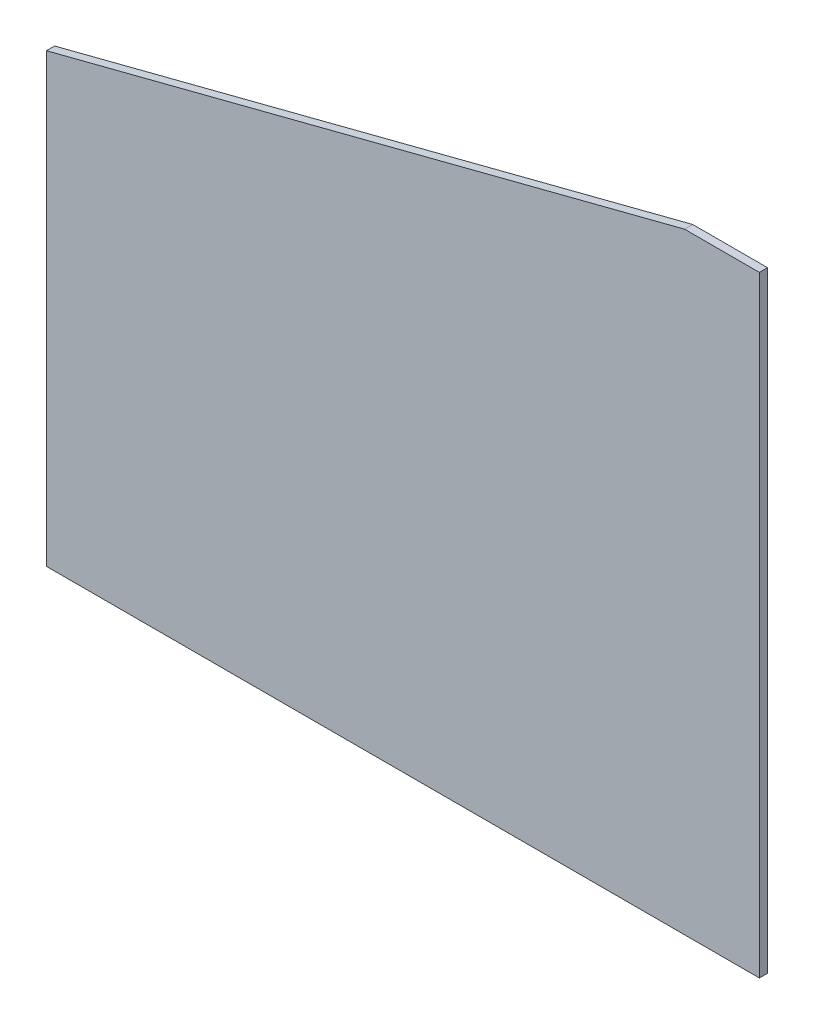
ISO-10303-21;
HEADER;
FILE_DESCRIPTION(('STEP AP214'),'2;1');
FILE_NAME('part.step','',(''),(''),'','','');
FILE_SCHEMA(('AUTOMOTIVE_DESIGN { 1 0 10303 214 1 1 1 1 }'));
ENDSEC;
DATA;
#1=APPLICATION_CONTEXT('core data for automotive mechanical design processes');
#2=APPLICATION_PROTOCOL_DEFINITION('international standard','automotive_design',2000,#1);
#3=PRODUCT_CONTEXT('',#1,'mechanical');
#4=PRODUCT('Part','Part','',(#3));
#5=PRODUCT_RELATED_PRODUCT_CATEGORY('part','',(#4));
#6=PRODUCT_DEFINITION_FORMATION('','',#4);
#7=PRODUCT_DEFINITION_CONTEXT('part definition',#1,'design');
#8=PRODUCT_DEFINITION('design','',#6,#7);
#9=PRODUCT_DEFINITION_SHAPE('','',#8);
#10=(LENGTH_UNIT() NAMED_UNIT(*) SI_UNIT(.MILLI.,.METRE.));
#11=(NAMED_UNIT(*) PLANE_ANGLE_UNIT() SI_UNIT($,.RADIAN.));
#12=(NAMED_UNIT(*) SI_UNIT($,.STERADIAN.) SOLID_ANGLE_UNIT());
#13=UNCERTAINTY_MEASURE_WITH_UNIT(LENGTH_MEASURE(1.E-05),#10,'distance_accuracy_value','');
#14=(GEOMETRIC_REPRESENTATION_CONTEXT(3) GLOBAL_UNCERTAINTY_ASSIGNED_CONTEXT((#13)) GLOBAL_UNIT_ASSIGNED_CONTEXT((#10,
#11,#12)) REPRESENTATION_CONTEXT('',''));
#15=CARTESIAN_POINT('',(0.,0.,0.));
#16=DIRECTION('',(0.,0.,1.));
#17=DIRECTION('',(1.,0.,0.));
#18=AXIS2_PLACEMENT_3D('',#15,#16,#17);
#19=CARTESIAN_POINT('',(1400.,0.,16.));
#20=DIRECTION('',(0.,1.,0.));
#21=DIRECTION('',(-1.,0.,0.));
#22=AXIS2_PLACEMENT_3D('',#19,#20,#21);
#23=PLANE('',#22);
#24=DIRECTION('',(1.,0.,0.));
#25=VECTOR('',#24,1.);
#26=CARTESIAN_POINT('',(1400.,0.,0.));
#27=LINE('',#26,#25);
#28=CARTESIAN_POINT('',(0.,0.,0.));
#29=VERTEX_POINT('',#28);
#30=CARTESIAN_POINT('',(1400.,0.,0.));
#31=VERTEX_POINT('',#30);
#32=EDGE_CURVE('E106',#29,#31,#27,.T.);
#33=ORIENTED_EDGE('',*,*,#32,.T.);
#34=DIRECTION('',(0.,0.,-1.));
#35=VECTOR('',#34,1.);
#36=CARTESIAN_POINT('',(1400.,0.,16.));
#37=LINE('',#36,#35);
#38=CARTESIAN_POINT('',(1400.,0.,16.));
#39=VERTEX_POINT('',#38);
#40=EDGE_CURVE('E11',#39,#31,#37,.T.);
#41=ORIENTED_EDGE('',*,*,#40,.F.);
#42=DIRECTION('',(1.,0.,0.));
#43=VECTOR('',#42,1.);
#44=CARTESIAN_POINT('',(1400.,0.,16.));
#45=LINE('',#44,#43);
#46=CARTESIAN_POINT('',(0.,0.,16.));
#47=VERTEX_POINT('',#46);
#48=EDGE_CURVE('E114',#47,#39,#45,.T.);
#49=ORIENTED_EDGE('',*,*,#48,.F.);
#50=DIRECTION('',(0.,0.,-1.));
#51=VECTOR('',#50,1.);
#52=CARTESIAN_POINT('',(0.,0.,16.));
#53=LINE('',#52,#51);
#54=EDGE_CURVE('E102',#47,#29,#53,.T.);
#55=ORIENTED_EDGE('',*,*,#54,.T.);
#56=EDGE_LOOP('',(#33,#41,#49,#55));
#57=FACE_BOUND('',#56,.T.);
#58=ADVANCED_FACE('F32',(#57),#23,.F.);
#59=CARTESIAN_POINT('',(1400.,1200.,16.));
#60=DIRECTION('',(-1.,0.,0.));
#61=DIRECTION('',(0.,0.,1.));
#62=AXIS2_PLACEMENT_3D('',#59,#60,#61);
#63=PLANE('',#62);
#64=DIRECTION('',(0.,1.,0.));
#65=VECTOR('',#64,1.);
#66=CARTESIAN_POINT('',(1400.,1200.,0.));
#67=LINE('',#66,#65);
#68=CARTESIAN_POINT('',(1400.,1200.,0.));
#69=VERTEX_POINT('',#68);
#70=EDGE_CURVE('E109',#31,#69,#67,.T.);
#71=ORIENTED_EDGE('',*,*,#70,.T.);
#72=DIRECTION('',(0.,0.,-1.));
#73=VECTOR('',#72,1.);
#74=CARTESIAN_POINT('',(1400.,1200.,16.));
#75=LINE('',#74,#73);
#76=CARTESIAN_POINT('',(1400.,1200.,16.));
#77=VERTEX_POINT('',#76);
#78=EDGE_CURVE('E40',#77,#69,#75,.T.);
#79=ORIENTED_EDGE('',*,*,#78,.F.);
#80=DIRECTION('',(0.,1.,0.));
#81=VECTOR('',#80,1.);
#82=CARTESIAN_POINT('',(1400.,1200.,16.));
#83=LINE('',#82,#81);
#84=EDGE_CURVE('E82',#39,#77,#83,.T.);
#85=ORIENTED_EDGE('',*,*,#84,.F.);
#86=ORIENTED_EDGE('',*,*,#40,.T.);
#87=EDGE_LOOP('',(#71,#79,#85,#86));
#88=FACE_BOUND('',#87,.T.);
#89=ADVANCED_FACE('F133',(#88),#63,.F.);
#90=CARTESIAN_POINT('',(1252.97743198655,1200.,16.));
#91=DIRECTION('',(0.,-1.,0.));
#92=DIRECTION('',(1.,0.,0.));
#93=AXIS2_PLACEMENT_3D('',#90,#91,#92);
#94=PLANE('',#93);
#95=DIRECTION('',(-1.,0.,0.));
#96=VECTOR('',#95,1.);
#97=CARTESIAN_POINT('',(1252.97743198655,1200.,0.));
#98=LINE('',#97,#96);
#99=CARTESIAN_POINT('',(1252.97743198655,1200.,0.));
#100=VERTEX_POINT('',#99);
#101=EDGE_CURVE('E97',#69,#100,#98,.T.);
#102=ORIENTED_EDGE('',*,*,#101,.T.);
#103=DIRECTION('',(0.,0.,-1.));
#104=VECTOR('',#103,1.);
#105=CARTESIAN_POINT('',(1252.97743198655,1200.,16.));
#106=LINE('',#105,#104);
#107=CARTESIAN_POINT('',(1252.97743198655,1200.,16.));
#108=VERTEX_POINT('',#107);
#109=EDGE_CURVE('E94',#108,#100,#106,.T.);
#110=ORIENTED_EDGE('',*,*,#109,.F.);
#111=DIRECTION('',(-1.,0.,0.));
#112=VECTOR('',#111,1.);
#113=CARTESIAN_POINT('',(1252.97743198655,1200.,16.));
#114=LINE('',#113,#112);
#115=EDGE_CURVE('E86',#77,#108,#114,.T.);
#116=ORIENTED_EDGE('',*,*,#115,.F.);
#117=ORIENTED_EDGE('',*,*,#78,.T.);
#118=EDGE_LOOP('',(#102,#110,#116,#117));
#119=FACE_BOUND('',#118,.T.);
#120=ADVANCED_FACE('F95',(#119),#94,.F.);
#121=CARTESIAN_POINT('',(0.,877.,16.));
#122=DIRECTION('',(0.249625122036369,-0.968342552224329,0.));
#123=DIRECTION('',(0.968342552224329,0.249625122036369,0.));
#124=AXIS2_PLACEMENT_3D('',#121,#122,#123);
#125=PLANE('',#124);
#126=DIRECTION('',(-0.968342552224329,-0.249625122036369,0.));
#127=VECTOR('',#126,1.);
#128=CARTESIAN_POINT('',(0.,877.,0.));
#129=LINE('',#128,#127);
#130=CARTESIAN_POINT('',(0.,877.,0.));
#131=VERTEX_POINT('',#130);
#132=EDGE_CURVE('E68',#100,#131,#129,.T.);
#133=ORIENTED_EDGE('',*,*,#132,.T.);
#134=DIRECTION('',(0.,0.,-1.));
#135=VECTOR('',#134,1.);
#136=CARTESIAN_POINT('',(0.,877.,16.));
#137=LINE('',#136,#135);
#138=CARTESIAN_POINT('',(0.,877.,16.));
#139=VERTEX_POINT('',#138);
#140=EDGE_CURVE('E98',#139,#131,#137,.T.);
#141=ORIENTED_EDGE('',*,*,#140,.F.);
#142=DIRECTION('',(-0.968342552224329,-0.249625122036369,0.));
#143=VECTOR('',#142,1.);
#144=CARTESIAN_POINT('',(0.,877.,16.));
#145=LINE('',#144,#143);
#146=EDGE_CURVE('E90',#108,#139,#145,.T.);
#147=ORIENTED_EDGE('',*,*,#146,.F.);
#148=ORIENTED_EDGE('',*,*,#109,.T.);
#149=EDGE_LOOP('',(#133,#141,#147,#148));
#150=FACE_BOUND('',#149,.T.);
#151=ADVANCED_FACE('F100',(#150),#125,.F.);
#152=CARTESIAN_POINT('',(0.,0.,16.));
#153=DIRECTION('',(1.,0.,0.));
#154=DIRECTION('',(0.,0.,-1.));
#155=AXIS2_PLACEMENT_3D('',#152,#153,#154);
#156=PLANE('',#155);
#157=DIRECTION('',(0.,-1.,0.));
#158=VECTOR('',#157,1.);
#159=CARTESIAN_POINT('',(0.,0.,0.));
#160=LINE('',#159,#158);
#161=EDGE_CURVE('E74',#131,#29,#160,.T.);
#162=ORIENTED_EDGE('',*,*,#161,.T.);
#163=ORIENTED_EDGE('',*,*,#54,.F.);
#164=DIRECTION('',(0.,-1.,0.));
#165=VECTOR('',#164,1.);
#166=CARTESIAN_POINT('',(0.,0.,16.));
#167=LINE('',#166,#165);
#168=EDGE_CURVE('E48',#139,#47,#167,.T.);
#169=ORIENTED_EDGE('',*,*,#168,.F.);
#170=ORIENTED_EDGE('',*,*,#140,.T.);
#171=EDGE_LOOP('',(#162,#163,#169,#170));
#172=FACE_BOUND('',#171,.T.);
#173=ADVANCED_FACE('F122',(#172),#156,.F.);
#174=CARTESIAN_POINT('',(0.,0.,16.));
#175=DIRECTION('',(0.,0.,-1.));
#176=DIRECTION('',(-1.,0.,0.));
#177=AXIS2_PLACEMENT_3D('',#174,#175,#176);
#178=PLANE('',#177);
#179=ORIENTED_EDGE('',*,*,#48,.T.);
#180=ORIENTED_EDGE('',*,*,#84,.T.);
#181=ORIENTED_EDGE('',*,*,#115,.T.);
#182=ORIENTED_EDGE('',*,*,#146,.T.);
#183=ORIENTED_EDGE('',*,*,#168,.T.);
#184=EDGE_LOOP('',(#179,#180,#181,#182,#183));
#185=FACE_BOUND('',#184,.T.);
#186=ADVANCED_FACE('F88',(#185),#178,.F.);
#187=CARTESIAN_POINT('',(0.,0.,0.));
#188=DIRECTION('',(0.,0.,-1.));
#189=DIRECTION('',(-1.,0.,0.));
#190=AXIS2_PLACEMENT_3D('',#187,#188,#189);
#191=PLANE('',#190);
#192=ORIENTED_EDGE('',*,*,#32,.F.);
#193=ORIENTED_EDGE('',*,*,#161,.F.);
#194=ORIENTED_EDGE('',*,*,#132,.F.);
#195=ORIENTED_EDGE('',*,*,#101,.F.);
#196=ORIENTED_EDGE('',*,*,#70,.F.);
#197=EDGE_LOOP('',(#192,#193,#194,#195,#196));
#198=FACE_BOUND('',#197,.T.);
#199=ADVANCED_FACE('F118',(#198),#191,.T.);
#200=CLOSED_SHELL('',(#58,#89,#120,#151,#173,#186,#199));
#201=MANIFOLD_SOLID_BREP('B2',#200);
#202=ADVANCED_BREP_SHAPE_REPRESENTATION('',(#18,#201),#14);
#203=SHAPE_DEFINITION_REPRESENTATION(#9,#202);
ENDSEC;
END-ISO-10303-21;
